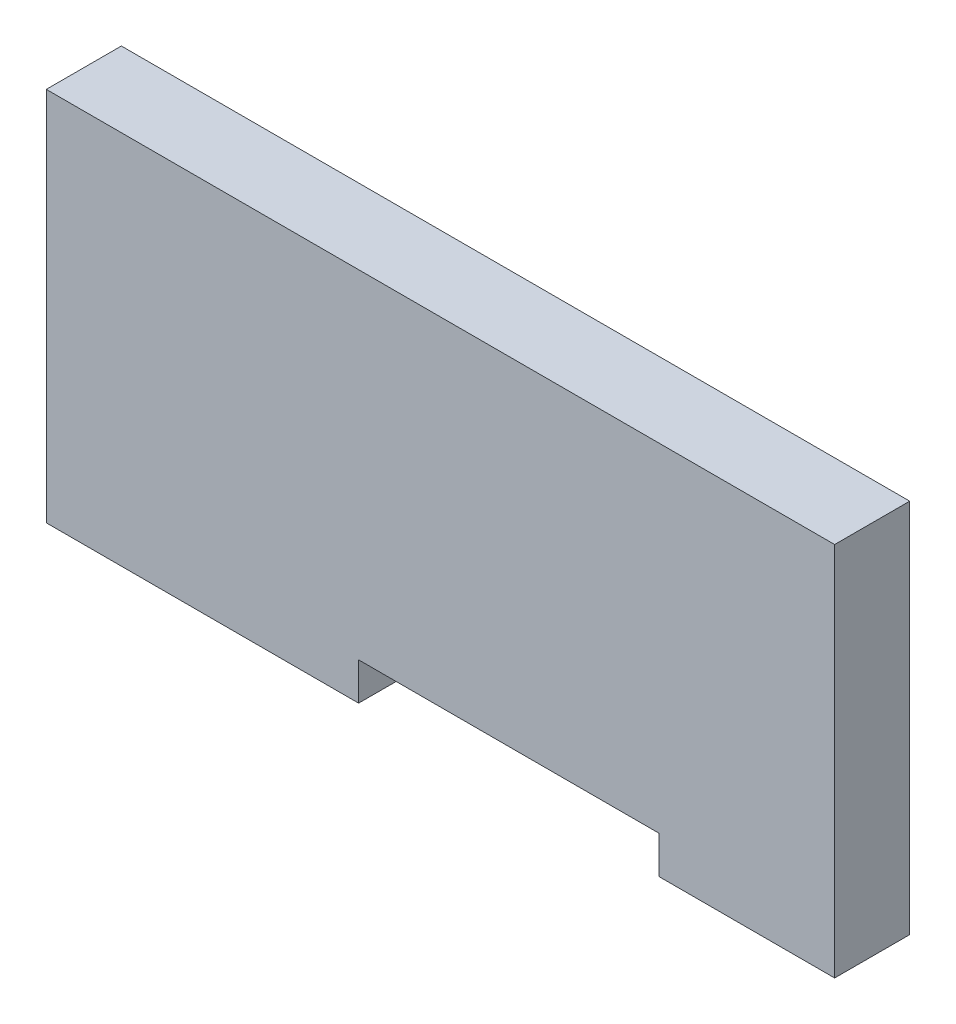
ISO-10303-21;
HEADER;
FILE_DESCRIPTION(('STEP AP214'),'2;1');
FILE_NAME('part.step','',(''),(''),'','','');
FILE_SCHEMA(('AUTOMOTIVE_DESIGN { 1 0 10303 214 1 1 1 1 }'));
ENDSEC;
DATA;
#1=APPLICATION_CONTEXT('core data for automotive mechanical design processes');
#2=APPLICATION_PROTOCOL_DEFINITION('international standard','automotive_design',2000,#1);
#3=PRODUCT_CONTEXT('',#1,'mechanical');
#4=PRODUCT('Part','Part','',(#3));
#5=PRODUCT_RELATED_PRODUCT_CATEGORY('part','',(#4));
#6=PRODUCT_DEFINITION_FORMATION('','',#4);
#7=PRODUCT_DEFINITION_CONTEXT('part definition',#1,'design');
#8=PRODUCT_DEFINITION('design','',#6,#7);
#9=PRODUCT_DEFINITION_SHAPE('','',#8);
#10=(LENGTH_UNIT() NAMED_UNIT(*) SI_UNIT(.MILLI.,.METRE.));
#11=(NAMED_UNIT(*) PLANE_ANGLE_UNIT() SI_UNIT($,.RADIAN.));
#12=(NAMED_UNIT(*) SI_UNIT($,.STERADIAN.) SOLID_ANGLE_UNIT());
#13=UNCERTAINTY_MEASURE_WITH_UNIT(LENGTH_MEASURE(1.E-05),#10,'distance_accuracy_value','');
#14=(GEOMETRIC_REPRESENTATION_CONTEXT(3) GLOBAL_UNCERTAINTY_ASSIGNED_CONTEXT((#13)) GLOBAL_UNIT_ASSIGNED_CONTEXT((#10,
#11,#12)) REPRESENTATION_CONTEXT('',''));
#15=CARTESIAN_POINT('',(0.,0.,0.));
#16=DIRECTION('',(0.,0.,1.));
#17=DIRECTION('',(1.,0.,0.));
#18=AXIS2_PLACEMENT_3D('',#15,#16,#17);
#19=CARTESIAN_POINT('',(-105.,-50.,20.));
#20=DIRECTION('',(1.,0.,0.));
#21=DIRECTION('',(0.,0.,-1.));
#22=AXIS2_PLACEMENT_3D('',#19,#20,#21);
#23=PLANE('',#22);
#24=DIRECTION('',(0.,-1.,0.));
#25=VECTOR('',#24,1.);
#26=CARTESIAN_POINT('',(-105.,-50.,0.));
#27=LINE('',#26,#25);
#28=CARTESIAN_POINT('',(-105.,50.,0.));
#29=VERTEX_POINT('',#28);
#30=CARTESIAN_POINT('',(-105.,-50.,0.));
#31=VERTEX_POINT('',#30);
#32=EDGE_CURVE('E147',#29,#31,#27,.T.);
#33=ORIENTED_EDGE('',*,*,#32,.T.);
#34=DIRECTION('',(0.,0.,-1.));
#35=VECTOR('',#34,1.);
#36=CARTESIAN_POINT('',(-105.,-50.,20.));
#37=LINE('',#36,#35);
#38=CARTESIAN_POINT('',(-105.,-50.,20.));
#39=VERTEX_POINT('',#38);
#40=EDGE_CURVE('E11',#39,#31,#37,.T.);
#41=ORIENTED_EDGE('',*,*,#40,.F.);
#42=DIRECTION('',(0.,-1.,0.));
#43=VECTOR('',#42,1.);
#44=CARTESIAN_POINT('',(-105.,-50.,20.));
#45=LINE('',#44,#43);
#46=CARTESIAN_POINT('',(-105.,50.,20.));
#47=VERTEX_POINT('',#46);
#48=EDGE_CURVE('E166',#47,#39,#45,.T.);
#49=ORIENTED_EDGE('',*,*,#48,.F.);
#50=DIRECTION('',(0.,0.,-1.));
#51=VECTOR('',#50,1.);
#52=CARTESIAN_POINT('',(-105.,50.,20.));
#53=LINE('',#52,#51);
#54=EDGE_CURVE('E145',#47,#29,#53,.T.);
#55=ORIENTED_EDGE('',*,*,#54,.T.);
#56=EDGE_LOOP('',(#33,#41,#49,#55));
#57=FACE_BOUND('',#56,.T.);
#58=ADVANCED_FACE('F44',(#57),#23,.F.);
#59=CARTESIAN_POINT('',(-21.7999999999999,-50.,20.));
#60=DIRECTION('',(0.,1.,0.));
#61=DIRECTION('',(-1.,0.,0.));
#62=AXIS2_PLACEMENT_3D('',#59,#60,#61);
#63=PLANE('',#62);
#64=DIRECTION('',(1.,0.,0.));
#65=VECTOR('',#64,1.);
#66=CARTESIAN_POINT('',(-21.7999999999999,-50.,0.));
#67=LINE('',#66,#65);
#68=CARTESIAN_POINT('',(-21.7999999999999,-50.,0.));
#69=VERTEX_POINT('',#68);
#70=EDGE_CURVE('E148',#31,#69,#67,.T.);
#71=ORIENTED_EDGE('',*,*,#70,.T.);
#72=DIRECTION('',(0.,0.,-1.));
#73=VECTOR('',#72,1.);
#74=CARTESIAN_POINT('',(-21.7999999999999,-50.,20.));
#75=LINE('',#74,#73);
#76=CARTESIAN_POINT('',(-21.7999999999999,-50.,20.));
#77=VERTEX_POINT('',#76);
#78=EDGE_CURVE('E53',#77,#69,#75,.T.);
#79=ORIENTED_EDGE('',*,*,#78,.F.);
#80=DIRECTION('',(1.,0.,0.));
#81=VECTOR('',#80,1.);
#82=CARTESIAN_POINT('',(-21.7999999999999,-50.,20.));
#83=LINE('',#82,#81);
#84=EDGE_CURVE('E103',#39,#77,#83,.T.);
#85=ORIENTED_EDGE('',*,*,#84,.F.);
#86=ORIENTED_EDGE('',*,*,#40,.T.);
#87=EDGE_LOOP('',(#71,#79,#85,#86));
#88=FACE_BOUND('',#87,.T.);
#89=ADVANCED_FACE('F215',(#88),#63,.F.);
#90=CARTESIAN_POINT('',(-21.7999999999999,-50.,20.));
#91=DIRECTION('',(-1.,0.,0.));
#92=DIRECTION('',(0.,0.,1.));
#93=AXIS2_PLACEMENT_3D('',#90,#91,#92);
#94=PLANE('',#93);
#95=DIRECTION('',(0.,1.,0.));
#96=VECTOR('',#95,1.);
#97=CARTESIAN_POINT('',(-21.7999999999999,-50.,0.));
#98=LINE('',#97,#96);
#99=CARTESIAN_POINT('',(-21.7999999999999,-40.,0.));
#100=VERTEX_POINT('',#99);
#101=EDGE_CURVE('E153',#69,#100,#98,.T.);
#102=ORIENTED_EDGE('',*,*,#101,.T.);
#103=DIRECTION('',(0.,0.,-1.));
#104=VECTOR('',#103,1.);
#105=CARTESIAN_POINT('',(-21.7999999999999,-40.,20.));
#106=LINE('',#105,#104);
#107=CARTESIAN_POINT('',(-21.7999999999999,-40.,20.));
#108=VERTEX_POINT('',#107);
#109=EDGE_CURVE('E177',#108,#100,#106,.T.);
#110=ORIENTED_EDGE('',*,*,#109,.F.);
#111=DIRECTION('',(0.,1.,0.));
#112=VECTOR('',#111,1.);
#113=CARTESIAN_POINT('',(-21.7999999999999,-50.,20.));
#114=LINE('',#113,#112);
#115=EDGE_CURVE('E188',#77,#108,#114,.T.);
#116=ORIENTED_EDGE('',*,*,#115,.F.);
#117=ORIENTED_EDGE('',*,*,#78,.T.);
#118=EDGE_LOOP('',(#102,#110,#116,#117));
#119=FACE_BOUND('',#118,.T.);
#120=ADVANCED_FACE('F190',(#119),#94,.F.);
#121=CARTESIAN_POINT('',(58.2,-40.,20.));
#122=DIRECTION('',(0.,1.,0.));
#123=DIRECTION('',(-1.,0.,0.));
#124=AXIS2_PLACEMENT_3D('',#121,#122,#123);
#125=PLANE('',#124);
#126=DIRECTION('',(1.,0.,0.));
#127=VECTOR('',#126,1.);
#128=CARTESIAN_POINT('',(58.2,-40.,0.));
#129=LINE('',#128,#127);
#130=CARTESIAN_POINT('',(58.2,-40.,0.));
#131=VERTEX_POINT('',#130);
#132=EDGE_CURVE('E157',#100,#131,#129,.T.);
#133=ORIENTED_EDGE('',*,*,#132,.T.);
#134=DIRECTION('',(0.,0.,-1.));
#135=VECTOR('',#134,1.);
#136=CARTESIAN_POINT('',(58.2,-40.,20.));
#137=LINE('',#136,#135);
#138=CARTESIAN_POINT('',(58.2,-40.,20.));
#139=VERTEX_POINT('',#138);
#140=EDGE_CURVE('E172',#139,#131,#137,.T.);
#141=ORIENTED_EDGE('',*,*,#140,.F.);
#142=DIRECTION('',(1.,0.,0.));
#143=VECTOR('',#142,1.);
#144=CARTESIAN_POINT('',(58.2,-40.,20.));
#145=LINE('',#144,#143);
#146=EDGE_CURVE('E205',#108,#139,#145,.T.);
#147=ORIENTED_EDGE('',*,*,#146,.F.);
#148=ORIENTED_EDGE('',*,*,#109,.T.);
#149=EDGE_LOOP('',(#133,#141,#147,#148));
#150=FACE_BOUND('',#149,.T.);
#151=ADVANCED_FACE('F200',(#150),#125,.F.);
#152=CARTESIAN_POINT('',(58.2,-50.,20.));
#153=DIRECTION('',(1.,0.,0.));
#154=DIRECTION('',(0.,0.,-1.));
#155=AXIS2_PLACEMENT_3D('',#152,#153,#154);
#156=PLANE('',#155);
#157=DIRECTION('',(0.,-1.,0.));
#158=VECTOR('',#157,1.);
#159=CARTESIAN_POINT('',(58.2,-50.,0.));
#160=LINE('',#159,#158);
#161=CARTESIAN_POINT('',(58.2,-50.,0.));
#162=VERTEX_POINT('',#161);
#163=EDGE_CURVE('E159',#131,#162,#160,.T.);
#164=ORIENTED_EDGE('',*,*,#163,.T.);
#165=DIRECTION('',(0.,0.,-1.));
#166=VECTOR('',#165,1.);
#167=CARTESIAN_POINT('',(58.2,-50.,20.));
#168=LINE('',#167,#166);
#169=CARTESIAN_POINT('',(58.2,-50.,20.));
#170=VERTEX_POINT('',#169);
#171=EDGE_CURVE('E134',#170,#162,#168,.T.);
#172=ORIENTED_EDGE('',*,*,#171,.F.);
#173=DIRECTION('',(0.,-1.,0.));
#174=VECTOR('',#173,1.);
#175=CARTESIAN_POINT('',(58.2,-50.,20.));
#176=LINE('',#175,#174);
#177=EDGE_CURVE('E125',#139,#170,#176,.T.);
#178=ORIENTED_EDGE('',*,*,#177,.F.);
#179=ORIENTED_EDGE('',*,*,#140,.T.);
#180=EDGE_LOOP('',(#164,#172,#178,#179));
#181=FACE_BOUND('',#180,.T.);
#182=ADVANCED_FACE('F196',(#181),#156,.F.);
#183=CARTESIAN_POINT('',(105.,-50.,20.));
#184=DIRECTION('',(0.,1.,0.));
#185=DIRECTION('',(-1.,0.,0.));
#186=AXIS2_PLACEMENT_3D('',#183,#184,#185);
#187=PLANE('',#186);
#188=DIRECTION('',(1.,0.,0.));
#189=VECTOR('',#188,1.);
#190=CARTESIAN_POINT('',(105.,-50.,0.));
#191=LINE('',#190,#189);
#192=CARTESIAN_POINT('',(105.,-50.,0.));
#193=VERTEX_POINT('',#192);
#194=EDGE_CURVE('E133',#162,#193,#191,.T.);
#195=ORIENTED_EDGE('',*,*,#194,.T.);
#196=DIRECTION('',(0.,0.,-1.));
#197=VECTOR('',#196,1.);
#198=CARTESIAN_POINT('',(105.,-50.,20.));
#199=LINE('',#198,#197);
#200=CARTESIAN_POINT('',(105.,-50.,20.));
#201=VERTEX_POINT('',#200);
#202=EDGE_CURVE('E127',#201,#193,#199,.T.);
#203=ORIENTED_EDGE('',*,*,#202,.F.);
#204=DIRECTION('',(1.,0.,0.));
#205=VECTOR('',#204,1.);
#206=CARTESIAN_POINT('',(105.,-50.,20.));
#207=LINE('',#206,#205);
#208=EDGE_CURVE('E118',#170,#201,#207,.T.);
#209=ORIENTED_EDGE('',*,*,#208,.F.);
#210=ORIENTED_EDGE('',*,*,#171,.T.);
#211=EDGE_LOOP('',(#195,#203,#209,#210));
#212=FACE_BOUND('',#211,.T.);
#213=ADVANCED_FACE('F131',(#212),#187,.F.);
#214=CARTESIAN_POINT('',(105.,-50.,20.));
#215=DIRECTION('',(-1.,0.,0.));
#216=DIRECTION('',(0.,-1.,0.));
#217=AXIS2_PLACEMENT_3D('',#214,#215,#216);
#218=PLANE('',#217);
#219=DIRECTION('',(0.,1.,0.));
#220=VECTOR('',#219,1.);
#221=CARTESIAN_POINT('',(105.,-50.,0.));
#222=LINE('',#221,#220);
#223=CARTESIAN_POINT('',(105.,50.,0.));
#224=VERTEX_POINT('',#223);
#225=EDGE_CURVE('E91',#193,#224,#222,.T.);
#226=ORIENTED_EDGE('',*,*,#225,.T.);
#227=DIRECTION('',(0.,0.,-1.));
#228=VECTOR('',#227,1.);
#229=CARTESIAN_POINT('',(105.,50.,20.));
#230=LINE('',#229,#228);
#231=CARTESIAN_POINT('',(105.,50.,20.));
#232=VERTEX_POINT('',#231);
#233=EDGE_CURVE('E136',#232,#224,#230,.T.);
#234=ORIENTED_EDGE('',*,*,#233,.F.);
#235=DIRECTION('',(0.,1.,0.));
#236=VECTOR('',#235,1.);
#237=CARTESIAN_POINT('',(105.,-50.,20.));
#238=LINE('',#237,#236);
#239=EDGE_CURVE('E122',#201,#232,#238,.T.);
#240=ORIENTED_EDGE('',*,*,#239,.F.);
#241=ORIENTED_EDGE('',*,*,#202,.T.);
#242=EDGE_LOOP('',(#226,#234,#240,#241));
#243=FACE_BOUND('',#242,.T.);
#244=ADVANCED_FACE('F138',(#243),#218,.F.);
#245=CARTESIAN_POINT('',(105.,50.,20.));
#246=DIRECTION('',(0.,-1.,0.));
#247=DIRECTION('',(1.,0.,0.));
#248=AXIS2_PLACEMENT_3D('',#245,#246,#247);
#249=PLANE('',#248);
#250=DIRECTION('',(-1.,0.,0.));
#251=VECTOR('',#250,1.);
#252=CARTESIAN_POINT('',(105.,50.,0.));
#253=LINE('',#252,#251);
#254=EDGE_CURVE('E100',#224,#29,#253,.T.);
#255=ORIENTED_EDGE('',*,*,#254,.T.);
#256=ORIENTED_EDGE('',*,*,#54,.F.);
#257=DIRECTION('',(-1.,0.,0.));
#258=VECTOR('',#257,1.);
#259=CARTESIAN_POINT('',(105.,50.,20.));
#260=LINE('',#259,#258);
#261=EDGE_CURVE('E65',#232,#47,#260,.T.);
#262=ORIENTED_EDGE('',*,*,#261,.F.);
#263=ORIENTED_EDGE('',*,*,#233,.T.);
#264=EDGE_LOOP('',(#255,#256,#262,#263));
#265=FACE_BOUND('',#264,.T.);
#266=ADVANCED_FACE('F229',(#265),#249,.F.);
#267=CARTESIAN_POINT('',(0.,0.,20.));
#268=DIRECTION('',(0.,0.,1.));
#269=DIRECTION('',(1.,0.,0.));
#270=AXIS2_PLACEMENT_3D('',#267,#268,#269);
#271=PLANE('',#270);
#272=ORIENTED_EDGE('',*,*,#48,.T.);
#273=ORIENTED_EDGE('',*,*,#84,.T.);
#274=ORIENTED_EDGE('',*,*,#115,.T.);
#275=ORIENTED_EDGE('',*,*,#146,.T.);
#276=ORIENTED_EDGE('',*,*,#177,.T.);
#277=ORIENTED_EDGE('',*,*,#208,.T.);
#278=ORIENTED_EDGE('',*,*,#239,.T.);
#279=ORIENTED_EDGE('',*,*,#261,.T.);
#280=EDGE_LOOP('',(#272,#273,#274,#275,#276,#277,#278,#279));
#281=FACE_BOUND('',#280,.T.);
#282=ADVANCED_FACE('F116',(#281),#271,.T.);
#283=CARTESIAN_POINT('',(0.,0.,0.));
#284=DIRECTION('',(0.,0.,1.));
#285=DIRECTION('',(1.,0.,0.));
#286=AXIS2_PLACEMENT_3D('',#283,#284,#285);
#287=PLANE('',#286);
#288=ORIENTED_EDGE('',*,*,#32,.F.);
#289=ORIENTED_EDGE('',*,*,#254,.F.);
#290=ORIENTED_EDGE('',*,*,#225,.F.);
#291=ORIENTED_EDGE('',*,*,#194,.F.);
#292=ORIENTED_EDGE('',*,*,#163,.F.);
#293=ORIENTED_EDGE('',*,*,#132,.F.);
#294=ORIENTED_EDGE('',*,*,#101,.F.);
#295=ORIENTED_EDGE('',*,*,#70,.F.);
#296=EDGE_LOOP('',(#288,#289,#290,#291,#292,#293,#294,#295));
#297=FACE_BOUND('',#296,.T.);
#298=ADVANCED_FACE('F194',(#297),#287,.F.);
#299=CLOSED_SHELL('',(#58,#89,#120,#151,#182,#213,#244,#266,#282,#298));
#300=MANIFOLD_SOLID_BREP('B2',#299);
#301=ADVANCED_BREP_SHAPE_REPRESENTATION('',(#18,#300),#14);
#302=SHAPE_DEFINITION_REPRESENTATION(#9,#301);
ENDSEC;
END-ISO-10303-21;
